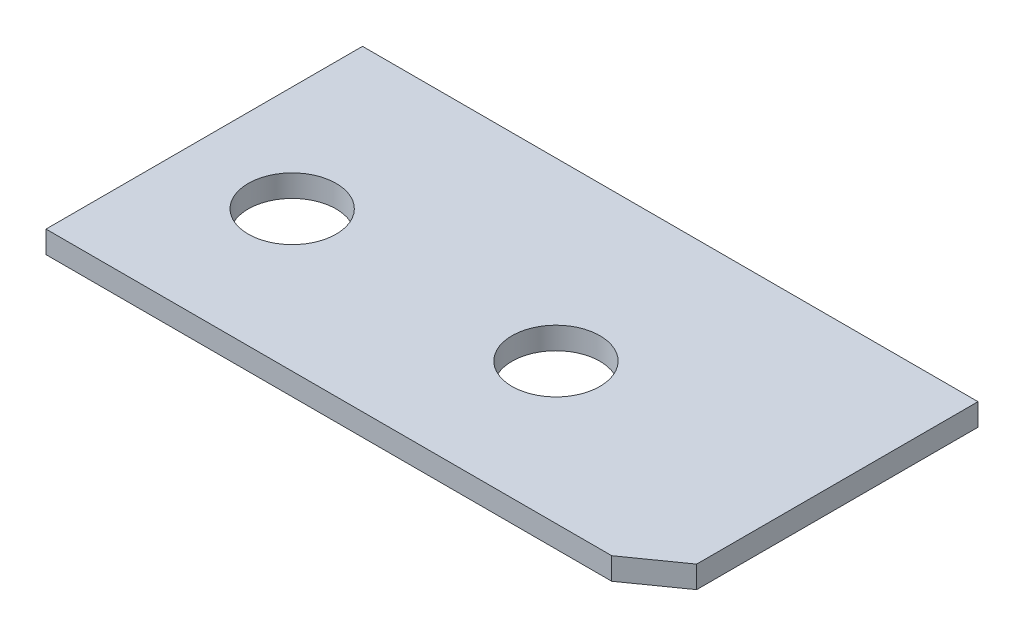
ISO-10303-21;
HEADER;
FILE_DESCRIPTION(('STEP AP214'),'2;1');
FILE_NAME('part.step','',(''),(''),'','','');
FILE_SCHEMA(('AUTOMOTIVE_DESIGN { 1 0 10303 214 1 1 1 1 }'));
ENDSEC;
DATA;
#1=APPLICATION_CONTEXT('core data for automotive mechanical design processes');
#2=APPLICATION_PROTOCOL_DEFINITION('international standard','automotive_design',2000,#1);
#3=PRODUCT_CONTEXT('',#1,'mechanical');
#4=PRODUCT('Part','Part','',(#3));
#5=PRODUCT_RELATED_PRODUCT_CATEGORY('part','',(#4));
#6=PRODUCT_DEFINITION_FORMATION('','',#4);
#7=PRODUCT_DEFINITION_CONTEXT('part definition',#1,'design');
#8=PRODUCT_DEFINITION('design','',#6,#7);
#9=PRODUCT_DEFINITION_SHAPE('','',#8);
#10=(LENGTH_UNIT() NAMED_UNIT(*) SI_UNIT(.MILLI.,.METRE.));
#11=(NAMED_UNIT(*) PLANE_ANGLE_UNIT() SI_UNIT($,.RADIAN.));
#12=(NAMED_UNIT(*) SI_UNIT($,.STERADIAN.) SOLID_ANGLE_UNIT());
#13=UNCERTAINTY_MEASURE_WITH_UNIT(LENGTH_MEASURE(1.E-05),#10,'distance_accuracy_value','');
#14=(GEOMETRIC_REPRESENTATION_CONTEXT(3) GLOBAL_UNCERTAINTY_ASSIGNED_CONTEXT((#13)) GLOBAL_UNIT_ASSIGNED_CONTEXT((#10,
#11,#12)) REPRESENTATION_CONTEXT('',''));
#15=CARTESIAN_POINT('',(0.,0.,0.));
#16=DIRECTION('',(0.,0.,1.));
#17=DIRECTION('',(1.,0.,0.));
#18=AXIS2_PLACEMENT_3D('',#15,#16,#17);
#19=CARTESIAN_POINT('',(0.,1.26,0.));
#20=DIRECTION('',(0.,1.,0.));
#21=DIRECTION('',(0.,0.,1.));
#22=AXIS2_PLACEMENT_3D('',#19,#20,#21);
#23=PLANE('',#22);
#24=CARTESIAN_POINT('',(3.5,1.26,1.));
#25=DIRECTION('',(0.,1.,0.));
#26=DIRECTION('',(0.,0.,1.));
#27=AXIS2_PLACEMENT_3D('',#24,#25,#26);
#28=CIRCLE('',#27,2.5);
#29=CARTESIAN_POINT('',(3.5,1.26,3.5));
#30=VERTEX_POINT('',#29);
#31=EDGE_CURVE('E122',#30,#30,#28,.T.);
#32=ORIENTED_EDGE('',*,*,#31,.F.);
#33=EDGE_LOOP('',(#32));
#34=FACE_BOUND('',#33,.T.);
#35=DIRECTION('',(0.,0.,1.));
#36=VECTOR('',#35,1.);
#37=CARTESIAN_POINT('',(-17.5,1.26,-9.));
#38=LINE('',#37,#36);
#39=CARTESIAN_POINT('',(-17.5,1.26,-9.));
#40=VERTEX_POINT('',#39);
#41=CARTESIAN_POINT('',(-17.5,1.26,9.));
#42=VERTEX_POINT('',#41);
#43=EDGE_CURVE('E127',#40,#42,#38,.T.);
#44=ORIENTED_EDGE('',*,*,#43,.T.);
#45=DIRECTION('',(1.,0.,0.));
#46=VECTOR('',#45,1.);
#47=CARTESIAN_POINT('',(-17.5,1.26,9.));
#48=LINE('',#47,#46);
#49=CARTESIAN_POINT('',(14.6715728752538,1.26,9.));
#50=VERTEX_POINT('',#49);
#51=EDGE_CURVE('E94',#42,#50,#48,.T.);
#52=ORIENTED_EDGE('',*,*,#51,.T.);
#53=DIRECTION('',(0.816496580927725,0.,-0.577350269189628));
#54=VECTOR('',#53,1.);
#55=CARTESIAN_POINT('',(14.6715728752538,1.26,9.));
#56=LINE('',#55,#54);
#57=CARTESIAN_POINT('',(17.5,1.26,6.99999999999999));
#58=VERTEX_POINT('',#57);
#59=EDGE_CURVE('E98',#50,#58,#56,.T.);
#60=ORIENTED_EDGE('',*,*,#59,.T.);
#61=DIRECTION('',(0.,0.,-1.));
#62=VECTOR('',#61,1.);
#63=CARTESIAN_POINT('',(17.5,1.26,6.99999999999999));
#64=LINE('',#63,#62);
#65=CARTESIAN_POINT('',(17.5,1.26,-9.));
#66=VERTEX_POINT('',#65);
#67=EDGE_CURVE('E102',#58,#66,#64,.T.);
#68=ORIENTED_EDGE('',*,*,#67,.T.);
#69=DIRECTION('',(-1.,0.,0.));
#70=VECTOR('',#69,1.);
#71=CARTESIAN_POINT('',(17.5,1.26,-9.));
#72=LINE('',#71,#70);
#73=EDGE_CURVE('E60',#66,#40,#72,.T.);
#74=ORIENTED_EDGE('',*,*,#73,.T.);
#75=EDGE_LOOP('',(#44,#52,#60,#68,#74));
#76=FACE_BOUND('',#75,.T.);
#77=CARTESIAN_POINT('',(-11.5,1.26,0.999999999999999));
#78=DIRECTION('',(0.,1.,0.));
#79=DIRECTION('',(0.,0.,1.));
#80=AXIS2_PLACEMENT_3D('',#77,#78,#79);
#81=CIRCLE('',#80,2.5);
#82=CARTESIAN_POINT('',(-11.5,1.26,3.5));
#83=VERTEX_POINT('',#82);
#84=EDGE_CURVE('E164',#83,#83,#81,.T.);
#85=ORIENTED_EDGE('',*,*,#84,.F.);
#86=EDGE_LOOP('',(#85));
#87=FACE_BOUND('',#86,.T.);
#88=ADVANCED_FACE('F43',(#34,#76,#87),#23,.T.);
#89=CARTESIAN_POINT('',(0.,0.,0.));
#90=DIRECTION('',(0.,1.,0.));
#91=DIRECTION('',(0.,0.,1.));
#92=AXIS2_PLACEMENT_3D('',#89,#90,#91);
#93=PLANE('',#92);
#94=DIRECTION('',(0.,0.,1.));
#95=VECTOR('',#94,1.);
#96=CARTESIAN_POINT('',(-17.5,0.,-9.));
#97=LINE('',#96,#95);
#98=CARTESIAN_POINT('',(-17.5,0.,-9.));
#99=VERTEX_POINT('',#98);
#100=CARTESIAN_POINT('',(-17.5,0.,9.));
#101=VERTEX_POINT('',#100);
#102=EDGE_CURVE('E118',#99,#101,#97,.T.);
#103=ORIENTED_EDGE('',*,*,#102,.F.);
#104=DIRECTION('',(-1.,0.,0.));
#105=VECTOR('',#104,1.);
#106=CARTESIAN_POINT('',(17.5,0.,-9.));
#107=LINE('',#106,#105);
#108=CARTESIAN_POINT('',(17.5,0.,-9.));
#109=VERTEX_POINT('',#108);
#110=EDGE_CURVE('E86',#109,#99,#107,.T.);
#111=ORIENTED_EDGE('',*,*,#110,.F.);
#112=DIRECTION('',(0.,0.,-1.));
#113=VECTOR('',#112,1.);
#114=CARTESIAN_POINT('',(17.5,0.,6.99999999999999));
#115=LINE('',#114,#113);
#116=CARTESIAN_POINT('',(17.5,0.,6.99999999999999));
#117=VERTEX_POINT('',#116);
#118=EDGE_CURVE('E80',#117,#109,#115,.T.);
#119=ORIENTED_EDGE('',*,*,#118,.F.);
#120=DIRECTION('',(0.816496580927725,0.,-0.577350269189628));
#121=VECTOR('',#120,1.);
#122=CARTESIAN_POINT('',(14.6715728752538,0.,9.));
#123=LINE('',#122,#121);
#124=CARTESIAN_POINT('',(14.6715728752538,0.,9.));
#125=VERTEX_POINT('',#124);
#126=EDGE_CURVE('E109',#125,#117,#123,.T.);
#127=ORIENTED_EDGE('',*,*,#126,.F.);
#128=DIRECTION('',(1.,0.,0.));
#129=VECTOR('',#128,1.);
#130=CARTESIAN_POINT('',(-17.5,0.,9.));
#131=LINE('',#130,#129);
#132=EDGE_CURVE('E121',#101,#125,#131,.T.);
#133=ORIENTED_EDGE('',*,*,#132,.F.);
#134=EDGE_LOOP('',(#103,#111,#119,#127,#133));
#135=FACE_BOUND('',#134,.T.);
#136=CARTESIAN_POINT('',(3.5,0.,1.));
#137=DIRECTION('',(0.,1.,0.));
#138=DIRECTION('',(0.,0.,1.));
#139=AXIS2_PLACEMENT_3D('',#136,#137,#138);
#140=CIRCLE('',#139,2.5);
#141=CARTESIAN_POINT('',(3.5,0.,3.5));
#142=VERTEX_POINT('',#141);
#143=EDGE_CURVE('E170',#142,#142,#140,.T.);
#144=ORIENTED_EDGE('',*,*,#143,.T.);
#145=EDGE_LOOP('',(#144));
#146=FACE_BOUND('',#145,.T.);
#147=CARTESIAN_POINT('',(-11.5,0.,0.999999999999999));
#148=DIRECTION('',(0.,1.,0.));
#149=DIRECTION('',(0.,0.,1.));
#150=AXIS2_PLACEMENT_3D('',#147,#148,#149);
#151=CIRCLE('',#150,2.5);
#152=CARTESIAN_POINT('',(-11.5,0.,3.5));
#153=VERTEX_POINT('',#152);
#154=EDGE_CURVE('E167',#153,#153,#151,.T.);
#155=ORIENTED_EDGE('',*,*,#154,.T.);
#156=EDGE_LOOP('',(#155));
#157=FACE_BOUND('',#156,.T.);
#158=ADVANCED_FACE('F131',(#135,#146,#157),#93,.F.);
#159=CARTESIAN_POINT('',(-17.5,1.26,-9.));
#160=DIRECTION('',(1.,0.,0.));
#161=DIRECTION('',(0.,0.,-1.));
#162=AXIS2_PLACEMENT_3D('',#159,#160,#161);
#163=PLANE('',#162);
#164=ORIENTED_EDGE('',*,*,#102,.T.);
#165=DIRECTION('',(0.,-1.,0.));
#166=VECTOR('',#165,1.);
#167=CARTESIAN_POINT('',(-17.5,1.26,9.));
#168=LINE('',#167,#166);
#169=EDGE_CURVE('E11',#42,#101,#168,.T.);
#170=ORIENTED_EDGE('',*,*,#169,.F.);
#171=ORIENTED_EDGE('',*,*,#43,.F.);
#172=DIRECTION('',(0.,-1.,0.));
#173=VECTOR('',#172,1.);
#174=CARTESIAN_POINT('',(-17.5,1.26,-9.));
#175=LINE('',#174,#173);
#176=EDGE_CURVE('E114',#40,#99,#175,.T.);
#177=ORIENTED_EDGE('',*,*,#176,.T.);
#178=EDGE_LOOP('',(#164,#170,#171,#177));
#179=FACE_BOUND('',#178,.T.);
#180=ADVANCED_FACE('F45',(#179),#163,.F.);
#181=CARTESIAN_POINT('',(-17.5,1.26,9.));
#182=DIRECTION('',(0.,0.,-1.));
#183=DIRECTION('',(-1.,0.,0.));
#184=AXIS2_PLACEMENT_3D('',#181,#182,#183);
#185=PLANE('',#184);
#186=ORIENTED_EDGE('',*,*,#132,.T.);
#187=DIRECTION('',(0.,-1.,0.));
#188=VECTOR('',#187,1.);
#189=CARTESIAN_POINT('',(14.6715728752538,1.26,9.));
#190=LINE('',#189,#188);
#191=EDGE_CURVE('E52',#50,#125,#190,.T.);
#192=ORIENTED_EDGE('',*,*,#191,.F.);
#193=ORIENTED_EDGE('',*,*,#51,.F.);
#194=ORIENTED_EDGE('',*,*,#169,.T.);
#195=EDGE_LOOP('',(#186,#192,#193,#194));
#196=FACE_BOUND('',#195,.T.);
#197=ADVANCED_FACE('F202',(#196),#185,.F.);
#198=CARTESIAN_POINT('',(14.6715728752538,1.26,9.));
#199=DIRECTION('',(-0.577350269189628,0.,-0.816496580927725));
#200=DIRECTION('',(-0.816496580927725,0.,0.577350269189628));
#201=AXIS2_PLACEMENT_3D('',#198,#199,#200);
#202=PLANE('',#201);
#203=ORIENTED_EDGE('',*,*,#126,.T.);
#204=DIRECTION('',(0.,-1.,0.));
#205=VECTOR('',#204,1.);
#206=CARTESIAN_POINT('',(17.5,1.26,6.99999999999999));
#207=LINE('',#206,#205);
#208=EDGE_CURVE('E106',#58,#117,#207,.T.);
#209=ORIENTED_EDGE('',*,*,#208,.F.);
#210=ORIENTED_EDGE('',*,*,#59,.F.);
#211=ORIENTED_EDGE('',*,*,#191,.T.);
#212=EDGE_LOOP('',(#203,#209,#210,#211));
#213=FACE_BOUND('',#212,.T.);
#214=ADVANCED_FACE('F107',(#213),#202,.F.);
#215=CARTESIAN_POINT('',(17.5,1.26,6.99999999999999));
#216=DIRECTION('',(-1.,0.,0.));
#217=DIRECTION('',(0.,0.,1.));
#218=AXIS2_PLACEMENT_3D('',#215,#216,#217);
#219=PLANE('',#218);
#220=ORIENTED_EDGE('',*,*,#118,.T.);
#221=DIRECTION('',(0.,-1.,0.));
#222=VECTOR('',#221,1.);
#223=CARTESIAN_POINT('',(17.5,1.26,-9.));
#224=LINE('',#223,#222);
#225=EDGE_CURVE('E110',#66,#109,#224,.T.);
#226=ORIENTED_EDGE('',*,*,#225,.F.);
#227=ORIENTED_EDGE('',*,*,#67,.F.);
#228=ORIENTED_EDGE('',*,*,#208,.T.);
#229=EDGE_LOOP('',(#220,#226,#227,#228));
#230=FACE_BOUND('',#229,.T.);
#231=ADVANCED_FACE('F112',(#230),#219,.F.);
#232=CARTESIAN_POINT('',(17.5,1.26,-9.));
#233=DIRECTION('',(0.,0.,1.));
#234=DIRECTION('',(1.,0.,0.));
#235=AXIS2_PLACEMENT_3D('',#232,#233,#234);
#236=PLANE('',#235);
#237=ORIENTED_EDGE('',*,*,#110,.T.);
#238=ORIENTED_EDGE('',*,*,#176,.F.);
#239=ORIENTED_EDGE('',*,*,#73,.F.);
#240=ORIENTED_EDGE('',*,*,#225,.T.);
#241=EDGE_LOOP('',(#237,#238,#239,#240));
#242=FACE_BOUND('',#241,.T.);
#243=ADVANCED_FACE('F136',(#242),#236,.F.);
#244=CARTESIAN_POINT('',(3.5,1.26,1.));
#245=DIRECTION('',(0.,-1.,0.));
#246=DIRECTION('',(0.,0.,-1.));
#247=AXIS2_PLACEMENT_3D('',#244,#245,#246);
#248=CYLINDRICAL_SURFACE('',#247,2.5);
#249=ORIENTED_EDGE('',*,*,#31,.T.);
#250=EDGE_LOOP('',(#249));
#251=FACE_BOUND('',#250,.T.);
#252=ORIENTED_EDGE('',*,*,#143,.F.);
#253=EDGE_LOOP('',(#252));
#254=FACE_BOUND('',#253,.T.);
#255=ADVANCED_FACE('F138',(#251,#254),#248,.F.);
#256=CARTESIAN_POINT('',(-11.5,1.26,0.999999999999999));
#257=DIRECTION('',(0.,-1.,0.));
#258=DIRECTION('',(0.,0.,-1.));
#259=AXIS2_PLACEMENT_3D('',#256,#257,#258);
#260=CYLINDRICAL_SURFACE('',#259,2.5);
#261=ORIENTED_EDGE('',*,*,#84,.T.);
#262=EDGE_LOOP('',(#261));
#263=FACE_BOUND('',#262,.T.);
#264=ORIENTED_EDGE('',*,*,#154,.F.);
#265=EDGE_LOOP('',(#264));
#266=FACE_BOUND('',#265,.T.);
#267=ADVANCED_FACE('F144',(#263,#266),#260,.F.);
#268=CLOSED_SHELL('',(#88,#158,#180,#197,#214,#231,#243,#255,#267));
#269=MANIFOLD_SOLID_BREP('B2',#268);
#270=ADVANCED_BREP_SHAPE_REPRESENTATION('',(#18,#269),#14);
#271=SHAPE_DEFINITION_REPRESENTATION(#9,#270);
ENDSEC;
END-ISO-10303-21;
